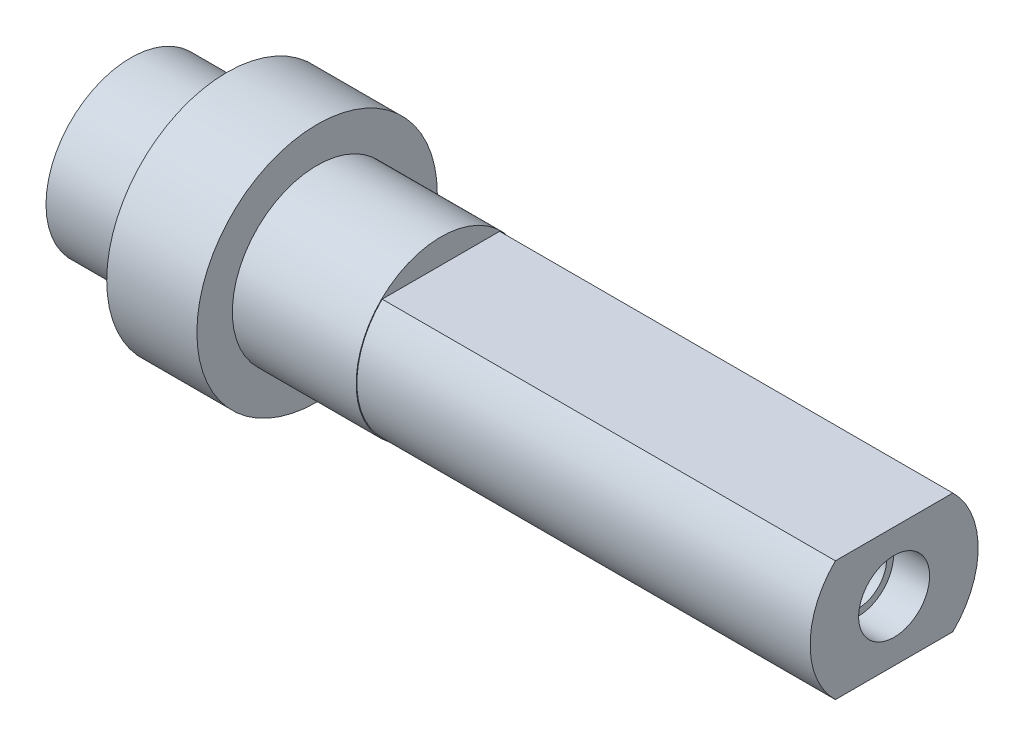
ISO-10303-21;
HEADER;
FILE_DESCRIPTION(('STEP AP214'),'2;1');
FILE_NAME('part.step','',(''),(''),'','','');
FILE_SCHEMA(('AUTOMOTIVE_DESIGN { 1 0 10303 214 1 1 1 1 }'));
ENDSEC;
DATA;
#1=APPLICATION_CONTEXT('core data for automotive mechanical design processes');
#2=APPLICATION_PROTOCOL_DEFINITION('international standard','automotive_design',2000,#1);
#3=PRODUCT_CONTEXT('',#1,'mechanical');
#4=PRODUCT('Part','Part','',(#3));
#5=PRODUCT_RELATED_PRODUCT_CATEGORY('part','',(#4));
#6=PRODUCT_DEFINITION_FORMATION('','',#4);
#7=PRODUCT_DEFINITION_CONTEXT('part definition',#1,'design');
#8=PRODUCT_DEFINITION('design','',#6,#7);
#9=PRODUCT_DEFINITION_SHAPE('','',#8);
#10=(LENGTH_UNIT() NAMED_UNIT(*) SI_UNIT(.MILLI.,.METRE.));
#11=(NAMED_UNIT(*) PLANE_ANGLE_UNIT() SI_UNIT($,.RADIAN.));
#12=(NAMED_UNIT(*) SI_UNIT($,.STERADIAN.) SOLID_ANGLE_UNIT());
#13=UNCERTAINTY_MEASURE_WITH_UNIT(LENGTH_MEASURE(1.E-05),#10,'distance_accuracy_value','');
#14=(GEOMETRIC_REPRESENTATION_CONTEXT(3) GLOBAL_UNCERTAINTY_ASSIGNED_CONTEXT((#13)) GLOBAL_UNIT_ASSIGNED_CONTEXT((#10,
#11,#12)) REPRESENTATION_CONTEXT('',''));
#15=CARTESIAN_POINT('',(0.,0.,0.));
#16=DIRECTION('',(0.,0.,1.));
#17=DIRECTION('',(1.,0.,0.));
#18=AXIS2_PLACEMENT_3D('',#15,#16,#17);
#19=CARTESIAN_POINT('',(27.75,0.,0.));
#20=DIRECTION('',(-1.,0.,0.));
#21=DIRECTION('',(0.,0.,1.));
#22=AXIS2_PLACEMENT_3D('',#19,#20,#21);
#23=CYLINDRICAL_SURFACE('',#22,3.525);
#24=CARTESIAN_POINT('',(3.75,0.,0.));
#25=DIRECTION('',(1.,0.,0.));
#26=DIRECTION('',(0.,0.,-1.));
#27=AXIS2_PLACEMENT_3D('',#24,#25,#26);
#28=CIRCLE('',#27,3.525);
#29=CARTESIAN_POINT('',(3.75,0.,-3.525));
#30=VERTEX_POINT('',#29);
#31=EDGE_CURVE('E103',#30,#30,#28,.T.);
#32=ORIENTED_EDGE('',*,*,#31,.T.);
#33=EDGE_LOOP('',(#32));
#34=FACE_BOUND('',#33,.T.);
#35=CARTESIAN_POINT('',(8.9,0.,0.));
#36=DIRECTION('',(1.,0.,0.));
#37=DIRECTION('',(0.,0.,-1.));
#38=AXIS2_PLACEMENT_3D('',#35,#36,#37);
#39=CIRCLE('',#38,3.525);
#40=CARTESIAN_POINT('',(8.9,0.,-3.525));
#41=VERTEX_POINT('',#40);
#42=EDGE_CURVE('E119',#41,#41,#39,.T.);
#43=ORIENTED_EDGE('',*,*,#42,.F.);
#44=EDGE_LOOP('',(#43));
#45=FACE_BOUND('',#44,.T.);
#46=ADVANCED_FACE('F36',(#34,#45),#23,.T.);
#47=CARTESIAN_POINT('',(27.75,0.,0.));
#48=DIRECTION('',(1.,0.,0.));
#49=DIRECTION('',(0.,0.,-1.));
#50=AXIS2_PLACEMENT_3D('',#47,#48,#49);
#51=PLANE('',#50);
#52=CARTESIAN_POINT('',(27.75,0.,0.));
#53=DIRECTION('',(1.,0.,0.));
#54=DIRECTION('',(0.,0.,-1.));
#55=AXIS2_PLACEMENT_3D('',#52,#53,#54);
#56=CIRCLE('',#55,1.475);
#57=CARTESIAN_POINT('',(27.75,0.,-1.475));
#58=VERTEX_POINT('',#57);
#59=EDGE_CURVE('E137',#58,#58,#56,.T.);
#60=ORIENTED_EDGE('',*,*,#59,.F.);
#61=EDGE_LOOP('',(#60));
#62=FACE_BOUND('',#61,.T.);
#63=DIRECTION('',(0.,0.,-1.));
#64=VECTOR('',#63,1.);
#65=CARTESIAN_POINT('',(27.75,2.5,0.));
#66=LINE('',#65,#64);
#67=CARTESIAN_POINT('',(27.75,2.5,2.44234006641172));
#68=VERTEX_POINT('',#67);
#69=CARTESIAN_POINT('',(27.75,2.5,-2.44234006641172));
#70=VERTEX_POINT('',#69);
#71=EDGE_CURVE('E116',#68,#70,#66,.T.);
#72=ORIENTED_EDGE('',*,*,#71,.F.);
#73=CARTESIAN_POINT('',(27.75,0.,0.));
#74=DIRECTION('',(1.,0.,0.));
#75=DIRECTION('',(0.,0.,-1.));
#76=AXIS2_PLACEMENT_3D('',#73,#74,#75);
#77=CIRCLE('',#76,3.495);
#78=CARTESIAN_POINT('',(27.75,-2.5,2.44234006641172));
#79=VERTEX_POINT('',#78);
#80=EDGE_CURVE('E90',#68,#79,#77,.T.);
#81=ORIENTED_EDGE('',*,*,#80,.T.);
#82=DIRECTION('',(0.,0.,1.));
#83=VECTOR('',#82,1.);
#84=CARTESIAN_POINT('',(27.75,-2.5,0.));
#85=LINE('',#84,#83);
#86=CARTESIAN_POINT('',(27.75,-2.5,-2.44234006641172));
#87=VERTEX_POINT('',#86);
#88=EDGE_CURVE('E105',#87,#79,#85,.T.);
#89=ORIENTED_EDGE('',*,*,#88,.F.);
#90=EDGE_CURVE('E58',#87,#70,#77,.T.);
#91=ORIENTED_EDGE('',*,*,#90,.T.);
#92=EDGE_LOOP('',(#72,#81,#89,#91));
#93=FACE_BOUND('',#92,.T.);
#94=ADVANCED_FACE('F133',(#62,#93),#51,.T.);
#95=CARTESIAN_POINT('',(27.98,-2.5,6.3937354309414));
#96=DIRECTION('',(0.,1.,0.));
#97=DIRECTION('',(0.,0.,1.));
#98=AXIS2_PLACEMENT_3D('',#95,#96,#97);
#99=PLANE('',#98);
#100=DIRECTION('',(1.,0.,0.));
#101=VECTOR('',#100,1.);
#102=CARTESIAN_POINT('',(-5.38355697996826,-2.5,2.44234006641172));
#103=LINE('',#102,#101);
#104=CARTESIAN_POINT('',(8.9,-2.5,2.44234006641172));
#105=VERTEX_POINT('',#104);
#106=EDGE_CURVE('E83',#105,#79,#103,.T.);
#107=ORIENTED_EDGE('',*,*,#106,.F.);
#108=DIRECTION('',(0.,0.,-1.));
#109=VECTOR('',#108,1.);
#110=CARTESIAN_POINT('',(8.9,-2.5,6.3937354309414));
#111=LINE('',#110,#109);
#112=CARTESIAN_POINT('',(8.9,-2.5,-2.44234006641172));
#113=VERTEX_POINT('',#112);
#114=EDGE_CURVE('E87',#105,#113,#111,.T.);
#115=ORIENTED_EDGE('',*,*,#114,.T.);
#116=DIRECTION('',(1.,0.,0.));
#117=VECTOR('',#116,1.);
#118=CARTESIAN_POINT('',(-5.38355697996826,-2.5,-2.44234006641172));
#119=LINE('',#118,#117);
#120=EDGE_CURVE('E74',#87,#113,#119,.F.);
#121=ORIENTED_EDGE('',*,*,#120,.F.);
#122=ORIENTED_EDGE('',*,*,#88,.T.);
#123=EDGE_LOOP('',(#107,#115,#121,#122));
#124=FACE_BOUND('',#123,.T.);
#125=ADVANCED_FACE('F93',(#124),#99,.F.);
#126=CARTESIAN_POINT('',(27.98,2.5,6.3937354309414));
#127=DIRECTION('',(0.,-1.,0.));
#128=DIRECTION('',(0.,0.,-1.));
#129=AXIS2_PLACEMENT_3D('',#126,#127,#128);
#130=PLANE('',#129);
#131=DIRECTION('',(1.,0.,0.));
#132=VECTOR('',#131,1.);
#133=CARTESIAN_POINT('',(-5.38355697996826,2.5,-2.44234006641172));
#134=LINE('',#133,#132);
#135=CARTESIAN_POINT('',(8.9,2.5,-2.44234006641172));
#136=VERTEX_POINT('',#135);
#137=EDGE_CURVE('E12',#136,#70,#134,.T.);
#138=ORIENTED_EDGE('',*,*,#137,.F.);
#139=DIRECTION('',(0.,0.,1.));
#140=VECTOR('',#139,1.);
#141=CARTESIAN_POINT('',(8.9,2.5,6.3937354309414));
#142=LINE('',#141,#140);
#143=CARTESIAN_POINT('',(8.9,2.5,2.44234006641172));
#144=VERTEX_POINT('',#143);
#145=EDGE_CURVE('E89',#136,#144,#142,.T.);
#146=ORIENTED_EDGE('',*,*,#145,.T.);
#147=DIRECTION('',(1.,0.,0.));
#148=VECTOR('',#147,1.);
#149=CARTESIAN_POINT('',(-5.38355697996826,2.5,2.44234006641172));
#150=LINE('',#149,#148);
#151=EDGE_CURVE('E44',#68,#144,#150,.F.);
#152=ORIENTED_EDGE('',*,*,#151,.F.);
#153=ORIENTED_EDGE('',*,*,#71,.T.);
#154=EDGE_LOOP('',(#138,#146,#152,#153));
#155=FACE_BOUND('',#154,.T.);
#156=ADVANCED_FACE('F131',(#155),#130,.F.);
#157=CARTESIAN_POINT('',(3.75,0.,0.));
#158=DIRECTION('',(-1.,0.,0.));
#159=DIRECTION('',(0.,0.,1.));
#160=AXIS2_PLACEMENT_3D('',#157,#158,#159);
#161=CYLINDRICAL_SURFACE('',#160,5.);
#162=CARTESIAN_POINT('',(3.75,0.,0.));
#163=DIRECTION('',(1.,0.,0.));
#164=DIRECTION('',(0.,0.,-1.));
#165=AXIS2_PLACEMENT_3D('',#162,#163,#164);
#166=CIRCLE('',#165,5.);
#167=CARTESIAN_POINT('',(3.75,0.,-5.));
#168=VERTEX_POINT('',#167);
#169=EDGE_CURVE('E110',#168,#168,#166,.T.);
#170=ORIENTED_EDGE('',*,*,#169,.F.);
#171=EDGE_LOOP('',(#170));
#172=FACE_BOUND('',#171,.T.);
#173=CARTESIAN_POINT('',(0.,0.,0.));
#174=DIRECTION('',(1.,0.,0.));
#175=DIRECTION('',(0.,0.,-1.));
#176=AXIS2_PLACEMENT_3D('',#173,#174,#175);
#177=CIRCLE('',#176,5.);
#178=CARTESIAN_POINT('',(0.,0.,-5.));
#179=VERTEX_POINT('',#178);
#180=EDGE_CURVE('E97',#179,#179,#177,.T.);
#181=ORIENTED_EDGE('',*,*,#180,.T.);
#182=EDGE_LOOP('',(#181));
#183=FACE_BOUND('',#182,.T.);
#184=ADVANCED_FACE('F38',(#172,#183),#161,.T.);
#185=CARTESIAN_POINT('',(3.75,0.,0.));
#186=DIRECTION('',(1.,0.,0.));
#187=DIRECTION('',(0.,0.,-1.));
#188=AXIS2_PLACEMENT_3D('',#185,#186,#187);
#189=PLANE('',#188);
#190=ORIENTED_EDGE('',*,*,#31,.F.);
#191=EDGE_LOOP('',(#190));
#192=FACE_BOUND('',#191,.T.);
#193=ORIENTED_EDGE('',*,*,#169,.T.);
#194=EDGE_LOOP('',(#193));
#195=FACE_BOUND('',#194,.T.);
#196=ADVANCED_FACE('F184',(#192,#195),#189,.T.);
#197=CARTESIAN_POINT('',(0.,0.,0.));
#198=DIRECTION('',(1.,0.,0.));
#199=DIRECTION('',(0.,0.,-1.));
#200=AXIS2_PLACEMENT_3D('',#197,#198,#199);
#201=PLANE('',#200);
#202=CARTESIAN_POINT('',(0.,0.,0.));
#203=DIRECTION('',(-1.,0.,0.));
#204=DIRECTION('',(0.,0.,1.));
#205=AXIS2_PLACEMENT_3D('',#202,#203,#204);
#206=CIRCLE('',#205,3.525);
#207=CARTESIAN_POINT('',(0.,0.,3.525));
#208=VERTEX_POINT('',#207);
#209=EDGE_CURVE('E106',#208,#208,#206,.T.);
#210=ORIENTED_EDGE('',*,*,#209,.F.);
#211=EDGE_LOOP('',(#210));
#212=FACE_BOUND('',#211,.T.);
#213=ORIENTED_EDGE('',*,*,#180,.F.);
#214=EDGE_LOOP('',(#213));
#215=FACE_BOUND('',#214,.T.);
#216=ADVANCED_FACE('F182',(#212,#215),#201,.F.);
#217=CARTESIAN_POINT('',(-4.,0.,0.));
#218=DIRECTION('',(1.,0.,0.));
#219=DIRECTION('',(0.,0.,-1.));
#220=AXIS2_PLACEMENT_3D('',#217,#218,#219);
#221=CYLINDRICAL_SURFACE('',#220,3.525);
#222=CARTESIAN_POINT('',(-4.,0.,0.));
#223=DIRECTION('',(-1.,0.,0.));
#224=DIRECTION('',(0.,0.,1.));
#225=AXIS2_PLACEMENT_3D('',#222,#223,#224);
#226=CIRCLE('',#225,3.525);
#227=CARTESIAN_POINT('',(-4.,0.,3.525));
#228=VERTEX_POINT('',#227);
#229=EDGE_CURVE('E94',#228,#228,#226,.T.);
#230=ORIENTED_EDGE('',*,*,#229,.F.);
#231=EDGE_LOOP('',(#230));
#232=FACE_BOUND('',#231,.T.);
#233=ORIENTED_EDGE('',*,*,#209,.T.);
#234=EDGE_LOOP('',(#233));
#235=FACE_BOUND('',#234,.T.);
#236=ADVANCED_FACE('F178',(#232,#235),#221,.T.);
#237=CARTESIAN_POINT('',(-4.,0.,0.));
#238=DIRECTION('',(-1.,0.,0.));
#239=DIRECTION('',(0.,0.,1.));
#240=AXIS2_PLACEMENT_3D('',#237,#238,#239);
#241=PLANE('',#240);
#242=ORIENTED_EDGE('',*,*,#229,.T.);
#243=EDGE_LOOP('',(#242));
#244=FACE_BOUND('',#243,.T.);
#245=ADVANCED_FACE('F163',(#244),#241,.T.);
#246=CARTESIAN_POINT('',(8.9,0.,0.));
#247=DIRECTION('',(1.,0.,0.));
#248=DIRECTION('',(0.,0.,-1.));
#249=AXIS2_PLACEMENT_3D('',#246,#247,#248);
#250=PLANE('',#249);
#251=ORIENTED_EDGE('',*,*,#114,.F.);
#252=CARTESIAN_POINT('',(8.9,0.,0.));
#253=DIRECTION('',(1.,0.,0.));
#254=DIRECTION('',(0.,0.,-1.));
#255=AXIS2_PLACEMENT_3D('',#252,#253,#254);
#256=CIRCLE('',#255,3.495);
#257=EDGE_CURVE('E51',#105,#144,#256,.F.);
#258=ORIENTED_EDGE('',*,*,#257,.T.);
#259=ORIENTED_EDGE('',*,*,#145,.F.);
#260=EDGE_CURVE('E77',#136,#113,#256,.F.);
#261=ORIENTED_EDGE('',*,*,#260,.T.);
#262=EDGE_LOOP('',(#251,#258,#259,#261));
#263=FACE_BOUND('',#262,.T.);
#264=ORIENTED_EDGE('',*,*,#42,.T.);
#265=EDGE_LOOP('',(#264));
#266=FACE_BOUND('',#265,.T.);
#267=ADVANCED_FACE('F85',(#263,#266),#250,.T.);
#268=CARTESIAN_POINT('',(26.25,0.,0.));
#269=DIRECTION('',(1.,0.,0.));
#270=DIRECTION('',(0.,0.,-1.));
#271=AXIS2_PLACEMENT_3D('',#268,#269,#270);
#272=PLANE('',#271);
#273=CARTESIAN_POINT('',(26.25,0.,0.));
#274=DIRECTION('',(1.,0.,0.));
#275=DIRECTION('',(0.,0.,-1.));
#276=AXIS2_PLACEMENT_3D('',#273,#274,#275);
#277=CIRCLE('',#276,1.475);
#278=CARTESIAN_POINT('',(26.25,0.,-1.475));
#279=VERTEX_POINT('',#278);
#280=EDGE_CURVE('E124',#279,#279,#277,.T.);
#281=ORIENTED_EDGE('',*,*,#280,.T.);
#282=EDGE_LOOP('',(#281));
#283=FACE_BOUND('',#282,.T.);
#284=CARTESIAN_POINT('',(26.25,0.,0.));
#285=DIRECTION('',(1.,0.,0.));
#286=DIRECTION('',(0.,0.,-1.));
#287=AXIS2_PLACEMENT_3D('',#284,#285,#286);
#288=CIRCLE('',#287,1.19);
#289=CARTESIAN_POINT('',(26.25,0.,-1.19));
#290=VERTEX_POINT('',#289);
#291=EDGE_CURVE('E122',#290,#290,#288,.F.);
#292=ORIENTED_EDGE('',*,*,#291,.T.);
#293=EDGE_LOOP('',(#292));
#294=FACE_BOUND('',#293,.T.);
#295=ADVANCED_FACE('F152',(#283,#294),#272,.T.);
#296=CARTESIAN_POINT('',(26.25,0.,0.));
#297=DIRECTION('',(1.,0.,0.));
#298=DIRECTION('',(0.,0.,-1.));
#299=AXIS2_PLACEMENT_3D('',#296,#297,#298);
#300=CYLINDRICAL_SURFACE('',#299,1.475);
#301=ORIENTED_EDGE('',*,*,#280,.F.);
#302=EDGE_LOOP('',(#301));
#303=FACE_BOUND('',#302,.T.);
#304=ORIENTED_EDGE('',*,*,#59,.T.);
#305=EDGE_LOOP('',(#304));
#306=FACE_BOUND('',#305,.T.);
#307=ADVANCED_FACE('F154',(#303,#306),#300,.F.);
#308=CARTESIAN_POINT('',(19.75,0.,0.));
#309=DIRECTION('',(1.,0.,0.));
#310=DIRECTION('',(0.,0.,-1.));
#311=AXIS2_PLACEMENT_3D('',#308,#309,#310);
#312=PLANE('',#311);
#313=CARTESIAN_POINT('',(19.75,0.,0.));
#314=DIRECTION('',(1.,0.,0.));
#315=DIRECTION('',(0.,0.,-1.));
#316=AXIS2_PLACEMENT_3D('',#313,#314,#315);
#317=CIRCLE('',#316,1.19);
#318=CARTESIAN_POINT('',(19.75,0.,-1.19));
#319=VERTEX_POINT('',#318);
#320=EDGE_CURVE('E99',#319,#319,#317,.T.);
#321=ORIENTED_EDGE('',*,*,#320,.T.);
#322=EDGE_LOOP('',(#321));
#323=FACE_BOUND('',#322,.T.);
#324=ADVANCED_FACE('F144',(#323),#312,.T.);
#325=CARTESIAN_POINT('',(19.75,0.,0.));
#326=DIRECTION('',(1.,0.,0.));
#327=DIRECTION('',(0.,0.,-1.));
#328=AXIS2_PLACEMENT_3D('',#325,#326,#327);
#329=CYLINDRICAL_SURFACE('',#328,1.19);
#330=ORIENTED_EDGE('',*,*,#320,.F.);
#331=EDGE_LOOP('',(#330));
#332=FACE_BOUND('',#331,.T.);
#333=ORIENTED_EDGE('',*,*,#291,.F.);
#334=EDGE_LOOP('',(#333));
#335=FACE_BOUND('',#334,.T.);
#336=ADVANCED_FACE('F146',(#332,#335),#329,.F.);
#337=CARTESIAN_POINT('',(-5.38355697996826,0.,0.));
#338=DIRECTION('',(1.,0.,0.));
#339=DIRECTION('',(0.,0.,-1.));
#340=AXIS2_PLACEMENT_3D('',#337,#338,#339);
#341=CYLINDRICAL_SURFACE('',#340,3.495);
#342=ORIENTED_EDGE('',*,*,#106,.T.);
#343=ORIENTED_EDGE('',*,*,#80,.F.);
#344=ORIENTED_EDGE('',*,*,#151,.T.);
#345=ORIENTED_EDGE('',*,*,#257,.F.);
#346=EDGE_LOOP('',(#342,#343,#344,#345));
#347=FACE_BOUND('',#346,.T.);
#348=ADVANCED_FACE('F127',(#347),#341,.T.);
#349=ORIENTED_EDGE('',*,*,#120,.T.);
#350=ORIENTED_EDGE('',*,*,#260,.F.);
#351=ORIENTED_EDGE('',*,*,#137,.T.);
#352=ORIENTED_EDGE('',*,*,#90,.F.);
#353=EDGE_LOOP('',(#349,#350,#351,#352));
#354=FACE_BOUND('',#353,.T.);
#355=ADVANCED_FACE('F76',(#354),#341,.T.);
#356=CLOSED_SHELL('',(#46,#94,#125,#156,#184,#196,#216,#236,#245,#267,#295,#307,#324,#336,#348,#355));
#357=MANIFOLD_SOLID_BREP('B2',#356);
#358=ADVANCED_BREP_SHAPE_REPRESENTATION('',(#18,#357),#14);
#359=SHAPE_DEFINITION_REPRESENTATION(#9,#358);
ENDSEC;
END-ISO-10303-21;
